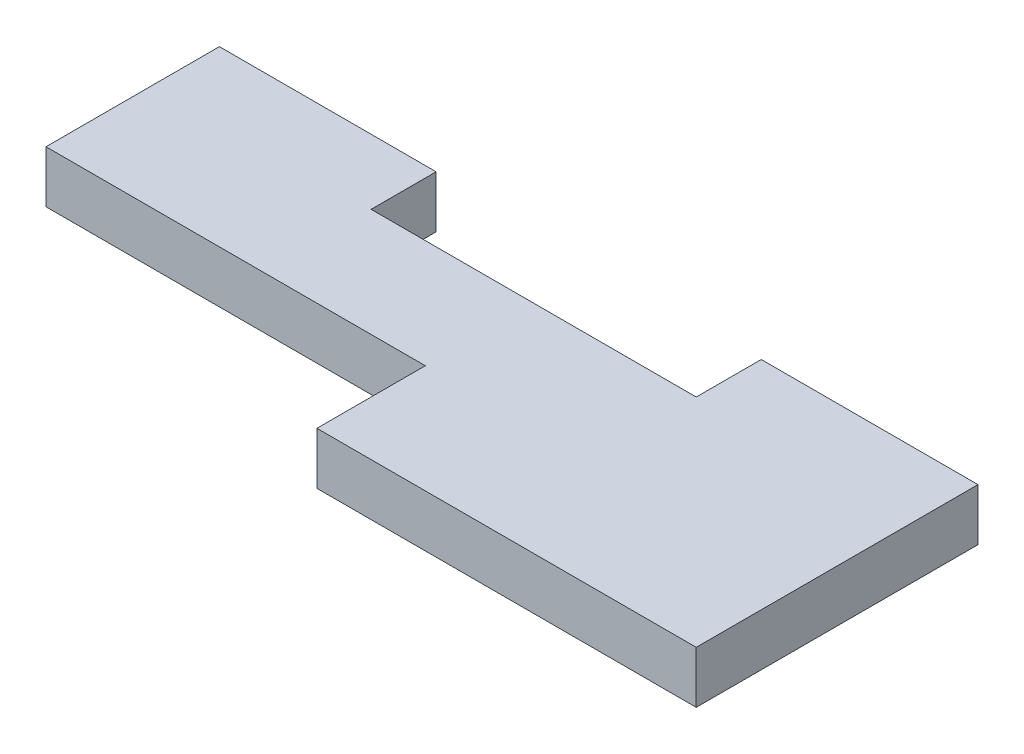
ISO-10303-21;
HEADER;
FILE_DESCRIPTION(('STEP AP214'),'2;1');
FILE_NAME('part.step','',(''),(''),'','','');
FILE_SCHEMA(('AUTOMOTIVE_DESIGN { 1 0 10303 214 1 1 1 1 }'));
ENDSEC;
DATA;
#1=APPLICATION_CONTEXT('core data for automotive mechanical design processes');
#2=APPLICATION_PROTOCOL_DEFINITION('international standard','automotive_design',2000,#1);
#3=PRODUCT_CONTEXT('',#1,'mechanical');
#4=PRODUCT('Part','Part','',(#3));
#5=PRODUCT_RELATED_PRODUCT_CATEGORY('part','',(#4));
#6=PRODUCT_DEFINITION_FORMATION('','',#4);
#7=PRODUCT_DEFINITION_CONTEXT('part definition',#1,'design');
#8=PRODUCT_DEFINITION('design','',#6,#7);
#9=PRODUCT_DEFINITION_SHAPE('','',#8);
#10=(LENGTH_UNIT() NAMED_UNIT(*) SI_UNIT(.MILLI.,.METRE.));
#11=(NAMED_UNIT(*) PLANE_ANGLE_UNIT() SI_UNIT($,.RADIAN.));
#12=(NAMED_UNIT(*) SI_UNIT($,.STERADIAN.) SOLID_ANGLE_UNIT());
#13=UNCERTAINTY_MEASURE_WITH_UNIT(LENGTH_MEASURE(1.E-05),#10,'distance_accuracy_value','');
#14=(GEOMETRIC_REPRESENTATION_CONTEXT(3) GLOBAL_UNCERTAINTY_ASSIGNED_CONTEXT((#13)) GLOBAL_UNIT_ASSIGNED_CONTEXT((#10,
#11,#12)) REPRESENTATION_CONTEXT('',''));
#15=CARTESIAN_POINT('',(0.,0.,0.));
#16=DIRECTION('',(0.,0.,1.));
#17=DIRECTION('',(1.,0.,0.));
#18=AXIS2_PLACEMENT_3D('',#15,#16,#17);
#19=CARTESIAN_POINT('',(0.,0.24,-0.5));
#20=DIRECTION('',(1.,0.,0.));
#21=DIRECTION('',(0.,0.,-1.));
#22=AXIS2_PLACEMENT_3D('',#19,#20,#21);
#23=PLANE('',#22);
#24=DIRECTION('',(0.,0.,1.));
#25=VECTOR('',#24,1.);
#26=CARTESIAN_POINT('',(0.,0.,-0.5));
#27=LINE('',#26,#25);
#28=CARTESIAN_POINT('',(0.,0.,-1.3));
#29=VERTEX_POINT('',#28);
#30=CARTESIAN_POINT('',(0.,0.,-0.5));
#31=VERTEX_POINT('',#30);
#32=EDGE_CURVE('E144',#29,#31,#27,.T.);
#33=ORIENTED_EDGE('',*,*,#32,.T.);
#34=DIRECTION('',(0.,-1.,0.));
#35=VECTOR('',#34,1.);
#36=CARTESIAN_POINT('',(0.,0.24,-0.5));
#37=LINE('',#36,#35);
#38=CARTESIAN_POINT('',(0.,0.24,-0.5));
#39=VERTEX_POINT('',#38);
#40=EDGE_CURVE('E11',#39,#31,#37,.T.);
#41=ORIENTED_EDGE('',*,*,#40,.F.);
#42=DIRECTION('',(0.,0.,1.));
#43=VECTOR('',#42,1.);
#44=CARTESIAN_POINT('',(0.,0.24,-0.5));
#45=LINE('',#44,#43);
#46=CARTESIAN_POINT('',(0.,0.24,-1.3));
#47=VERTEX_POINT('',#46);
#48=EDGE_CURVE('E162',#47,#39,#45,.T.);
#49=ORIENTED_EDGE('',*,*,#48,.F.);
#50=DIRECTION('',(0.,-1.,0.));
#51=VECTOR('',#50,1.);
#52=CARTESIAN_POINT('',(0.,0.24,-1.3));
#53=LINE('',#52,#51);
#54=EDGE_CURVE('E140',#47,#29,#53,.T.);
#55=ORIENTED_EDGE('',*,*,#54,.T.);
#56=EDGE_LOOP('',(#33,#41,#49,#55));
#57=FACE_BOUND('',#56,.T.);
#58=ADVANCED_FACE('F36',(#57),#23,.F.);
#59=CARTESIAN_POINT('',(1.75,0.24,-0.5));
#60=DIRECTION('',(0.,0.,-1.));
#61=DIRECTION('',(-1.,0.,0.));
#62=AXIS2_PLACEMENT_3D('',#59,#60,#61);
#63=PLANE('',#62);
#64=DIRECTION('',(1.,0.,0.));
#65=VECTOR('',#64,1.);
#66=CARTESIAN_POINT('',(1.75,0.,-0.5));
#67=LINE('',#66,#65);
#68=CARTESIAN_POINT('',(1.75,0.,-0.5));
#69=VERTEX_POINT('',#68);
#70=EDGE_CURVE('E147',#31,#69,#67,.T.);
#71=ORIENTED_EDGE('',*,*,#70,.T.);
#72=DIRECTION('',(0.,-1.,0.));
#73=VECTOR('',#72,1.);
#74=CARTESIAN_POINT('',(1.75,0.24,-0.5));
#75=LINE('',#74,#73);
#76=CARTESIAN_POINT('',(1.75,0.24,-0.5));
#77=VERTEX_POINT('',#76);
#78=EDGE_CURVE('E44',#77,#69,#75,.T.);
#79=ORIENTED_EDGE('',*,*,#78,.F.);
#80=DIRECTION('',(1.,0.,0.));
#81=VECTOR('',#80,1.);
#82=CARTESIAN_POINT('',(1.75,0.24,-0.5));
#83=LINE('',#82,#81);
#84=EDGE_CURVE('E101',#39,#77,#83,.T.);
#85=ORIENTED_EDGE('',*,*,#84,.F.);
#86=ORIENTED_EDGE('',*,*,#40,.T.);
#87=EDGE_LOOP('',(#71,#79,#85,#86));
#88=FACE_BOUND('',#87,.T.);
#89=ADVANCED_FACE('F211',(#88),#63,.F.);
#90=CARTESIAN_POINT('',(1.75,0.24,0.));
#91=DIRECTION('',(1.,0.,0.));
#92=DIRECTION('',(0.,0.,-1.));
#93=AXIS2_PLACEMENT_3D('',#90,#91,#92);
#94=PLANE('',#93);
#95=DIRECTION('',(0.,0.,1.));
#96=VECTOR('',#95,1.);
#97=CARTESIAN_POINT('',(1.75,0.,0.));
#98=LINE('',#97,#96);
#99=CARTESIAN_POINT('',(1.75,0.,0.));
#100=VERTEX_POINT('',#99);
#101=EDGE_CURVE('E149',#69,#100,#98,.T.);
#102=ORIENTED_EDGE('',*,*,#101,.T.);
#103=DIRECTION('',(0.,-1.,0.));
#104=VECTOR('',#103,1.);
#105=CARTESIAN_POINT('',(1.75,0.24,0.));
#106=LINE('',#105,#104);
#107=CARTESIAN_POINT('',(1.75,0.24,0.));
#108=VERTEX_POINT('',#107);
#109=EDGE_CURVE('E175',#108,#100,#106,.T.);
#110=ORIENTED_EDGE('',*,*,#109,.F.);
#111=DIRECTION('',(0.,0.,1.));
#112=VECTOR('',#111,1.);
#113=CARTESIAN_POINT('',(1.75,0.24,0.));
#114=LINE('',#113,#112);
#115=EDGE_CURVE('E183',#77,#108,#114,.T.);
#116=ORIENTED_EDGE('',*,*,#115,.F.);
#117=ORIENTED_EDGE('',*,*,#78,.T.);
#118=EDGE_LOOP('',(#102,#110,#116,#117));
#119=FACE_BOUND('',#118,.T.);
#120=ADVANCED_FACE('F181',(#119),#94,.F.);
#121=CARTESIAN_POINT('',(1.75,0.24,0.));
#122=DIRECTION('',(0.,0.,-1.));
#123=DIRECTION('',(-1.,0.,0.));
#124=AXIS2_PLACEMENT_3D('',#121,#122,#123);
#125=PLANE('',#124);
#126=DIRECTION('',(1.,0.,0.));
#127=VECTOR('',#126,1.);
#128=CARTESIAN_POINT('',(1.75,0.,0.));
#129=LINE('',#128,#127);
#130=CARTESIAN_POINT('',(3.5,0.,0.));
#131=VERTEX_POINT('',#130);
#132=EDGE_CURVE('E151',#100,#131,#129,.T.);
#133=ORIENTED_EDGE('',*,*,#132,.T.);
#134=DIRECTION('',(0.,-1.,0.));
#135=VECTOR('',#134,1.);
#136=CARTESIAN_POINT('',(3.5,0.24,0.));
#137=LINE('',#136,#135);
#138=CARTESIAN_POINT('',(3.5,0.24,0.));
#139=VERTEX_POINT('',#138);
#140=EDGE_CURVE('E172',#139,#131,#137,.T.);
#141=ORIENTED_EDGE('',*,*,#140,.F.);
#142=DIRECTION('',(1.,0.,0.));
#143=VECTOR('',#142,1.);
#144=CARTESIAN_POINT('',(1.75,0.24,0.));
#145=LINE('',#144,#143);
#146=EDGE_CURVE('E201',#108,#139,#145,.T.);
#147=ORIENTED_EDGE('',*,*,#146,.F.);
#148=ORIENTED_EDGE('',*,*,#109,.T.);
#149=EDGE_LOOP('',(#133,#141,#147,#148));
#150=FACE_BOUND('',#149,.T.);
#151=ADVANCED_FACE('F192',(#150),#125,.F.);
#152=CARTESIAN_POINT('',(3.5,0.24,-1.3));
#153=DIRECTION('',(-1.,0.,0.));
#154=DIRECTION('',(0.,0.,1.));
#155=AXIS2_PLACEMENT_3D('',#152,#153,#154);
#156=PLANE('',#155);
#157=DIRECTION('',(0.,0.,-1.));
#158=VECTOR('',#157,1.);
#159=CARTESIAN_POINT('',(3.5,0.,-1.3));
#160=LINE('',#159,#158);
#161=CARTESIAN_POINT('',(3.5,0.,-1.3));
#162=VERTEX_POINT('',#161);
#163=EDGE_CURVE('E153',#131,#162,#160,.T.);
#164=ORIENTED_EDGE('',*,*,#163,.T.);
#165=DIRECTION('',(0.,-1.,0.));
#166=VECTOR('',#165,1.);
#167=CARTESIAN_POINT('',(3.5,0.24,-1.3));
#168=LINE('',#167,#166);
#169=CARTESIAN_POINT('',(3.5,0.24,-1.3));
#170=VERTEX_POINT('',#169);
#171=EDGE_CURVE('E169',#170,#162,#168,.T.);
#172=ORIENTED_EDGE('',*,*,#171,.F.);
#173=DIRECTION('',(0.,0.,-1.));
#174=VECTOR('',#173,1.);
#175=CARTESIAN_POINT('',(3.5,0.24,-1.3));
#176=LINE('',#175,#174);
#177=EDGE_CURVE('E198',#139,#170,#176,.T.);
#178=ORIENTED_EDGE('',*,*,#177,.F.);
#179=ORIENTED_EDGE('',*,*,#140,.T.);
#180=EDGE_LOOP('',(#164,#172,#178,#179));
#181=FACE_BOUND('',#180,.T.);
#182=ADVANCED_FACE('F196',(#181),#156,.F.);
#183=CARTESIAN_POINT('',(2.5,0.24,-1.3));
#184=DIRECTION('',(0.,0.,1.));
#185=DIRECTION('',(1.,0.,0.));
#186=AXIS2_PLACEMENT_3D('',#183,#184,#185);
#187=PLANE('',#186);
#188=DIRECTION('',(-1.,0.,0.));
#189=VECTOR('',#188,1.);
#190=CARTESIAN_POINT('',(2.5,0.,-1.3));
#191=LINE('',#190,#189);
#192=CARTESIAN_POINT('',(2.5,0.,-1.3));
#193=VERTEX_POINT('',#192);
#194=EDGE_CURVE('E155',#162,#193,#191,.T.);
#195=ORIENTED_EDGE('',*,*,#194,.T.);
#196=DIRECTION('',(0.,-1.,0.));
#197=VECTOR('',#196,1.);
#198=CARTESIAN_POINT('',(2.5,0.24,-1.3));
#199=LINE('',#198,#197);
#200=CARTESIAN_POINT('',(2.5,0.24,-1.3));
#201=VERTEX_POINT('',#200);
#202=EDGE_CURVE('E166',#201,#193,#199,.T.);
#203=ORIENTED_EDGE('',*,*,#202,.F.);
#204=DIRECTION('',(-1.,0.,0.));
#205=VECTOR('',#204,1.);
#206=CARTESIAN_POINT('',(2.5,0.24,-1.3));
#207=LINE('',#206,#205);
#208=EDGE_CURVE('E200',#170,#201,#207,.T.);
#209=ORIENTED_EDGE('',*,*,#208,.F.);
#210=ORIENTED_EDGE('',*,*,#171,.T.);
#211=EDGE_LOOP('',(#195,#203,#209,#210));
#212=FACE_BOUND('',#211,.T.);
#213=ADVANCED_FACE('F223',(#212),#187,.F.);
#214=CARTESIAN_POINT('',(2.5,0.24,-1.));
#215=DIRECTION('',(1.,0.,0.));
#216=DIRECTION('',(0.,0.,-1.));
#217=AXIS2_PLACEMENT_3D('',#214,#215,#216);
#218=PLANE('',#217);
#219=DIRECTION('',(0.,0.,1.));
#220=VECTOR('',#219,1.);
#221=CARTESIAN_POINT('',(2.5,0.,-1.));
#222=LINE('',#221,#220);
#223=CARTESIAN_POINT('',(2.5,0.,-1.));
#224=VERTEX_POINT('',#223);
#225=EDGE_CURVE('E157',#193,#224,#222,.T.);
#226=ORIENTED_EDGE('',*,*,#225,.T.);
#227=DIRECTION('',(0.,-1.,0.));
#228=VECTOR('',#227,1.);
#229=CARTESIAN_POINT('',(2.5,0.24,-1.));
#230=LINE('',#229,#228);
#231=CARTESIAN_POINT('',(2.5,0.24,-1.));
#232=VERTEX_POINT('',#231);
#233=EDGE_CURVE('E135',#232,#224,#230,.T.);
#234=ORIENTED_EDGE('',*,*,#233,.F.);
#235=DIRECTION('',(0.,0.,1.));
#236=VECTOR('',#235,1.);
#237=CARTESIAN_POINT('',(2.5,0.24,-1.));
#238=LINE('',#237,#236);
#239=EDGE_CURVE('E126',#201,#232,#238,.T.);
#240=ORIENTED_EDGE('',*,*,#239,.F.);
#241=ORIENTED_EDGE('',*,*,#202,.T.);
#242=EDGE_LOOP('',(#226,#234,#240,#241));
#243=FACE_BOUND('',#242,.T.);
#244=ADVANCED_FACE('F226',(#243),#218,.F.);
#245=CARTESIAN_POINT('',(1.,0.24,-1.));
#246=DIRECTION('',(0.,0.,1.));
#247=DIRECTION('',(1.,0.,0.));
#248=AXIS2_PLACEMENT_3D('',#245,#246,#247);
#249=PLANE('',#248);
#250=DIRECTION('',(-1.,0.,0.));
#251=VECTOR('',#250,1.);
#252=CARTESIAN_POINT('',(1.,0.,-1.));
#253=LINE('',#252,#251);
#254=CARTESIAN_POINT('',(1.,0.,-1.));
#255=VERTEX_POINT('',#254);
#256=EDGE_CURVE('E134',#224,#255,#253,.T.);
#257=ORIENTED_EDGE('',*,*,#256,.T.);
#258=DIRECTION('',(0.,-1.,0.));
#259=VECTOR('',#258,1.);
#260=CARTESIAN_POINT('',(1.,0.24,-1.));
#261=LINE('',#260,#259);
#262=CARTESIAN_POINT('',(1.,0.24,-1.));
#263=VERTEX_POINT('',#262);
#264=EDGE_CURVE('E131',#263,#255,#261,.T.);
#265=ORIENTED_EDGE('',*,*,#264,.F.);
#266=DIRECTION('',(-1.,0.,0.));
#267=VECTOR('',#266,1.);
#268=CARTESIAN_POINT('',(1.,0.24,-1.));
#269=LINE('',#268,#267);
#270=EDGE_CURVE('E120',#232,#263,#269,.T.);
#271=ORIENTED_EDGE('',*,*,#270,.F.);
#272=ORIENTED_EDGE('',*,*,#233,.T.);
#273=EDGE_LOOP('',(#257,#265,#271,#272));
#274=FACE_BOUND('',#273,.T.);
#275=ADVANCED_FACE('F132',(#274),#249,.F.);
#276=CARTESIAN_POINT('',(1.,0.24,-1.3));
#277=DIRECTION('',(-1.,0.,0.));
#278=DIRECTION('',(0.,0.,1.));
#279=AXIS2_PLACEMENT_3D('',#276,#277,#278);
#280=PLANE('',#279);
#281=DIRECTION('',(0.,0.,-1.));
#282=VECTOR('',#281,1.);
#283=CARTESIAN_POINT('',(1.,0.,-1.3));
#284=LINE('',#283,#282);
#285=CARTESIAN_POINT('',(1.,0.,-1.3));
#286=VERTEX_POINT('',#285);
#287=EDGE_CURVE('E87',#255,#286,#284,.T.);
#288=ORIENTED_EDGE('',*,*,#287,.T.);
#289=DIRECTION('',(0.,-1.,0.));
#290=VECTOR('',#289,1.);
#291=CARTESIAN_POINT('',(1.,0.24,-1.3));
#292=LINE('',#291,#290);
#293=CARTESIAN_POINT('',(1.,0.24,-1.3));
#294=VERTEX_POINT('',#293);
#295=EDGE_CURVE('E136',#294,#286,#292,.T.);
#296=ORIENTED_EDGE('',*,*,#295,.F.);
#297=DIRECTION('',(0.,0.,-1.));
#298=VECTOR('',#297,1.);
#299=CARTESIAN_POINT('',(1.,0.24,-1.3));
#300=LINE('',#299,#298);
#301=EDGE_CURVE('E124',#263,#294,#300,.T.);
#302=ORIENTED_EDGE('',*,*,#301,.F.);
#303=ORIENTED_EDGE('',*,*,#264,.T.);
#304=EDGE_LOOP('',(#288,#296,#302,#303));
#305=FACE_BOUND('',#304,.T.);
#306=ADVANCED_FACE('F138',(#305),#280,.F.);
#307=CARTESIAN_POINT('',(0.,0.24,-1.3));
#308=DIRECTION('',(0.,0.,1.));
#309=DIRECTION('',(1.,0.,0.));
#310=AXIS2_PLACEMENT_3D('',#307,#308,#309);
#311=PLANE('',#310);
#312=DIRECTION('',(-1.,0.,0.));
#313=VECTOR('',#312,1.);
#314=CARTESIAN_POINT('',(0.,0.,-1.3));
#315=LINE('',#314,#313);
#316=EDGE_CURVE('E93',#286,#29,#315,.T.);
#317=ORIENTED_EDGE('',*,*,#316,.T.);
#318=ORIENTED_EDGE('',*,*,#54,.F.);
#319=DIRECTION('',(-1.,0.,0.));
#320=VECTOR('',#319,1.);
#321=CARTESIAN_POINT('',(0.,0.24,-1.3));
#322=LINE('',#321,#320);
#323=EDGE_CURVE('E52',#294,#47,#322,.T.);
#324=ORIENTED_EDGE('',*,*,#323,.F.);
#325=ORIENTED_EDGE('',*,*,#295,.T.);
#326=EDGE_LOOP('',(#317,#318,#324,#325));
#327=FACE_BOUND('',#326,.T.);
#328=ADVANCED_FACE('F235',(#327),#311,.F.);
#329=CARTESIAN_POINT('',(0.,0.24,0.));
#330=DIRECTION('',(0.,-1.,0.));
#331=DIRECTION('',(0.,0.,-1.));
#332=AXIS2_PLACEMENT_3D('',#329,#330,#331);
#333=PLANE('',#332);
#334=ORIENTED_EDGE('',*,*,#48,.T.);
#335=ORIENTED_EDGE('',*,*,#84,.T.);
#336=ORIENTED_EDGE('',*,*,#115,.T.);
#337=ORIENTED_EDGE('',*,*,#146,.T.);
#338=ORIENTED_EDGE('',*,*,#177,.T.);
#339=ORIENTED_EDGE('',*,*,#208,.T.);
#340=ORIENTED_EDGE('',*,*,#239,.T.);
#341=ORIENTED_EDGE('',*,*,#270,.T.);
#342=ORIENTED_EDGE('',*,*,#301,.T.);
#343=ORIENTED_EDGE('',*,*,#323,.T.);
#344=EDGE_LOOP('',(#334,#335,#336,#337,#338,#339,#340,#341,#342,#343));
#345=FACE_BOUND('',#344,.T.);
#346=ADVANCED_FACE('F122',(#345),#333,.F.);
#347=CARTESIAN_POINT('',(0.,0.,0.));
#348=DIRECTION('',(0.,-1.,0.));
#349=DIRECTION('',(0.,0.,-1.));
#350=AXIS2_PLACEMENT_3D('',#347,#348,#349);
#351=PLANE('',#350);
#352=ORIENTED_EDGE('',*,*,#32,.F.);
#353=ORIENTED_EDGE('',*,*,#316,.F.);
#354=ORIENTED_EDGE('',*,*,#287,.F.);
#355=ORIENTED_EDGE('',*,*,#256,.F.);
#356=ORIENTED_EDGE('',*,*,#225,.F.);
#357=ORIENTED_EDGE('',*,*,#194,.F.);
#358=ORIENTED_EDGE('',*,*,#163,.F.);
#359=ORIENTED_EDGE('',*,*,#132,.F.);
#360=ORIENTED_EDGE('',*,*,#101,.F.);
#361=ORIENTED_EDGE('',*,*,#70,.F.);
#362=EDGE_LOOP('',(#352,#353,#354,#355,#356,#357,#358,#359,#360,#361));
#363=FACE_BOUND('',#362,.T.);
#364=ADVANCED_FACE('F187',(#363),#351,.T.);
#365=CLOSED_SHELL('',(#58,#89,#120,#151,#182,#213,#244,#275,#306,#328,#346,#364));
#366=MANIFOLD_SOLID_BREP('B2',#365);
#367=ADVANCED_BREP_SHAPE_REPRESENTATION('',(#18,#366),#14);
#368=SHAPE_DEFINITION_REPRESENTATION(#9,#367);
ENDSEC;
END-ISO-10303-21;
